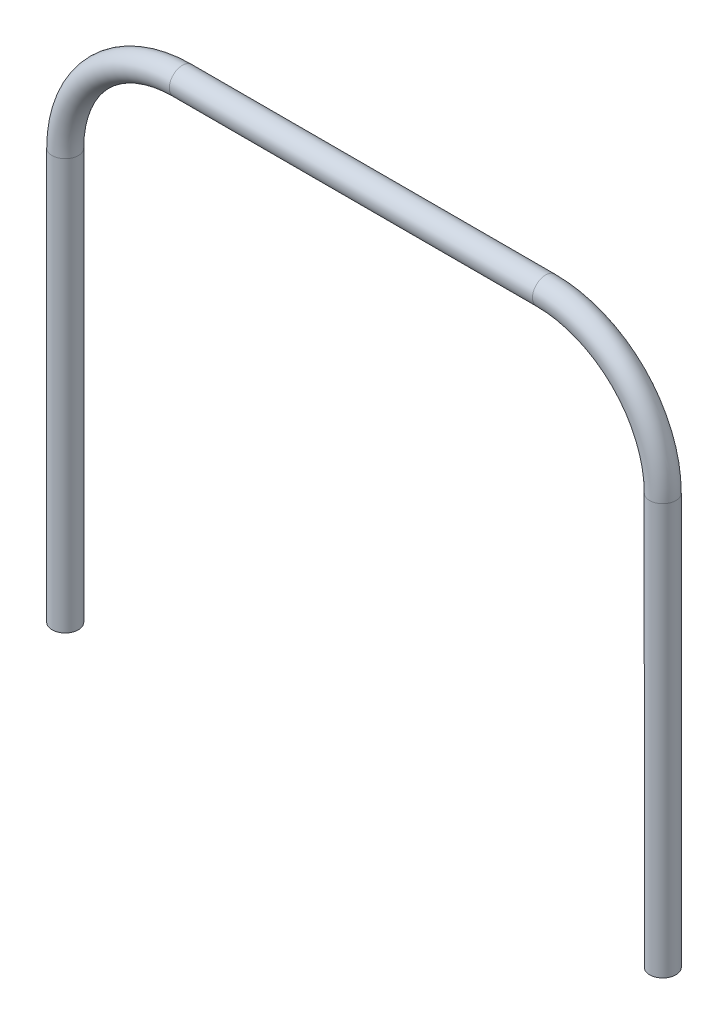
ISO-10303-21;
HEADER;
FILE_DESCRIPTION(('STEP AP214'),'2;1');
FILE_NAME('part.step','',(''),(''),'','','');
FILE_SCHEMA(('AUTOMOTIVE_DESIGN { 1 0 10303 214 1 1 1 1 }'));
ENDSEC;
DATA;
#1=APPLICATION_CONTEXT('core data for automotive mechanical design processes');
#2=APPLICATION_PROTOCOL_DEFINITION('international standard','automotive_design',2000,#1);
#3=PRODUCT_CONTEXT('',#1,'mechanical');
#4=PRODUCT('Part','Part','',(#3));
#5=PRODUCT_RELATED_PRODUCT_CATEGORY('part','',(#4));
#6=PRODUCT_DEFINITION_FORMATION('','',#4);
#7=PRODUCT_DEFINITION_CONTEXT('part definition',#1,'design');
#8=PRODUCT_DEFINITION('design','',#6,#7);
#9=PRODUCT_DEFINITION_SHAPE('','',#8);
#10=(LENGTH_UNIT() NAMED_UNIT(*) SI_UNIT(.MILLI.,.METRE.));
#11=(NAMED_UNIT(*) PLANE_ANGLE_UNIT() SI_UNIT($,.RADIAN.));
#12=(NAMED_UNIT(*) SI_UNIT($,.STERADIAN.) SOLID_ANGLE_UNIT());
#13=UNCERTAINTY_MEASURE_WITH_UNIT(LENGTH_MEASURE(1.E-05),#10,'distance_accuracy_value','');
#14=(GEOMETRIC_REPRESENTATION_CONTEXT(3) GLOBAL_UNCERTAINTY_ASSIGNED_CONTEXT((#13)) GLOBAL_UNIT_ASSIGNED_CONTEXT((#10,
#11,#12)) REPRESENTATION_CONTEXT('',''));
#15=CARTESIAN_POINT('',(0.,0.,0.));
#16=DIRECTION('',(0.,0.,1.));
#17=DIRECTION('',(1.,0.,0.));
#18=AXIS2_PLACEMENT_3D('',#15,#16,#17);
#19=CARTESIAN_POINT('',(0.,0.,0.));
#20=DIRECTION('',(0.,1.,0.));
#21=DIRECTION('',(0.,0.,1.));
#22=AXIS2_PLACEMENT_3D('',#19,#20,#21);
#23=CYLINDRICAL_SURFACE('',#22,19.);
#24=CARTESIAN_POINT('',(0.,596.,0.));
#25=DIRECTION('',(0.,1.,0.));
#26=DIRECTION('',(0.,0.,1.));
#27=AXIS2_PLACEMENT_3D('',#24,#25,#26);
#28=CIRCLE('',#27,19.);
#29=CARTESIAN_POINT('',(-19.,596.,0.));
#30=VERTEX_POINT('',#29);
#31=EDGE_CURVE('E85',#30,#30,#28,.T.);
#32=ORIENTED_EDGE('',*,*,#31,.F.);
#33=EDGE_LOOP('',(#32));
#34=FACE_BOUND('',#33,.T.);
#35=CARTESIAN_POINT('',(0.,0.,0.));
#36=DIRECTION('',(0.,1.,0.));
#37=DIRECTION('',(0.,0.,1.));
#38=AXIS2_PLACEMENT_3D('',#35,#36,#37);
#39=CIRCLE('',#38,19.);
#40=CARTESIAN_POINT('',(0.,0.,19.));
#41=VERTEX_POINT('',#40);
#42=EDGE_CURVE('E52',#41,#41,#39,.T.);
#43=ORIENTED_EDGE('',*,*,#42,.T.);
#44=EDGE_LOOP('',(#43));
#45=FACE_BOUND('',#44,.T.);
#46=ADVANCED_FACE('F37',(#34,#45),#23,.T.);
#47=CARTESIAN_POINT('',(170.,596.,0.));
#48=DIRECTION('',(0.,0.,-1.));
#49=DIRECTION('',(-1.,0.,0.));
#50=AXIS2_PLACEMENT_3D('',#47,#48,#49);
#51=TOROIDAL_SURFACE('',#50,170.,19.);
#52=CARTESIAN_POINT('',(170.,766.,0.));
#53=DIRECTION('',(1.,0.,0.));
#54=DIRECTION('',(0.,0.,1.));
#55=AXIS2_PLACEMENT_3D('',#52,#53,#54);
#56=CIRCLE('',#55,19.);
#57=CARTESIAN_POINT('',(170.,785.,0.));
#58=VERTEX_POINT('',#57);
#59=EDGE_CURVE('E88',#58,#58,#56,.T.);
#60=CARTESIAN_POINT('',(170.,596.,0.));
#61=DIRECTION('',(0.,0.,-1.));
#62=DIRECTION('',(-1.,0.,0.));
#63=AXIS2_PLACEMENT_3D('',#60,#61,#62);
#64=CIRCLE('',#63,189.);
#65=EDGE_CURVE('',#30,#58,#64,.T.);
#66=ORIENTED_EDGE('',*,*,#31,.T.);
#67=ORIENTED_EDGE('',*,*,#59,.F.);
#68=ORIENTED_EDGE('',*,*,#65,.T.);
#69=ORIENTED_EDGE('',*,*,#65,.F.);
#70=EDGE_LOOP('',(#66,#68,#67,#69));
#71=FACE_BOUND('',#70,.T.);
#72=ADVANCED_FACE('F106',(#71),#51,.T.);
#73=CARTESIAN_POINT('',(170.,766.,0.));
#74=DIRECTION('',(1.,0.,0.));
#75=DIRECTION('',(0.,0.,-1.));
#76=AXIS2_PLACEMENT_3D('',#73,#74,#75);
#77=CYLINDRICAL_SURFACE('',#76,19.);
#78=CARTESIAN_POINT('',(697.,766.,0.));
#79=DIRECTION('',(1.,0.,0.));
#80=DIRECTION('',(0.,0.,1.));
#81=AXIS2_PLACEMENT_3D('',#78,#79,#80);
#82=CIRCLE('',#81,19.);
#83=CARTESIAN_POINT('',(697.,785.,0.));
#84=VERTEX_POINT('',#83);
#85=EDGE_CURVE('E90',#84,#84,#82,.T.);
#86=ORIENTED_EDGE('',*,*,#85,.F.);
#87=EDGE_LOOP('',(#86));
#88=FACE_BOUND('',#87,.T.);
#89=ORIENTED_EDGE('',*,*,#59,.T.);
#90=EDGE_LOOP('',(#89));
#91=FACE_BOUND('',#90,.T.);
#92=ADVANCED_FACE('F100',(#88,#91),#77,.T.);
#93=CARTESIAN_POINT('',(697.,596.,0.));
#94=DIRECTION('',(0.,0.,-1.));
#95=DIRECTION('',(-1.,0.,0.));
#96=AXIS2_PLACEMENT_3D('',#93,#94,#95);
#97=TOROIDAL_SURFACE('',#96,170.,19.);
#98=CARTESIAN_POINT('',(867.,596.,0.));
#99=DIRECTION('',(0.,-1.,0.));
#100=DIRECTION('',(0.,0.,1.));
#101=AXIS2_PLACEMENT_3D('',#98,#99,#100);
#102=CIRCLE('',#101,19.);
#103=CARTESIAN_POINT('',(886.,596.,0.));
#104=VERTEX_POINT('',#103);
#105=EDGE_CURVE('E41',#104,#104,#102,.T.);
#106=CARTESIAN_POINT('',(697.,596.,0.));
#107=DIRECTION('',(0.,0.,-1.));
#108=DIRECTION('',(-1.,0.,0.));
#109=AXIS2_PLACEMENT_3D('',#106,#107,#108);
#110=CIRCLE('',#109,189.);
#111=EDGE_CURVE('',#84,#104,#110,.T.);
#112=ORIENTED_EDGE('',*,*,#85,.T.);
#113=ORIENTED_EDGE('',*,*,#105,.F.);
#114=ORIENTED_EDGE('',*,*,#111,.T.);
#115=ORIENTED_EDGE('',*,*,#111,.F.);
#116=EDGE_LOOP('',(#112,#114,#113,#115));
#117=FACE_BOUND('',#116,.T.);
#118=ADVANCED_FACE('F98',(#117),#97,.T.);
#119=CARTESIAN_POINT('',(867.,596.,0.));
#120=DIRECTION('',(0.,-1.,0.));
#121=DIRECTION('',(1.,0.,0.));
#122=AXIS2_PLACEMENT_3D('',#119,#120,#121);
#123=CYLINDRICAL_SURFACE('',#122,19.);
#124=CARTESIAN_POINT('',(867.,1.11022302462516E-13,0.));
#125=DIRECTION('',(0.,-1.,0.));
#126=DIRECTION('',(0.,0.,1.));
#127=AXIS2_PLACEMENT_3D('',#124,#125,#126);
#128=CIRCLE('',#127,19.);
#129=CARTESIAN_POINT('',(867.,1.11022302462516E-13,19.));
#130=VERTEX_POINT('',#129);
#131=EDGE_CURVE('E57',#130,#130,#128,.T.);
#132=ORIENTED_EDGE('',*,*,#131,.F.);
#133=EDGE_LOOP('',(#132));
#134=FACE_BOUND('',#133,.T.);
#135=ORIENTED_EDGE('',*,*,#105,.T.);
#136=EDGE_LOOP('',(#135));
#137=FACE_BOUND('',#136,.T.);
#138=ADVANCED_FACE('F39',(#134,#137),#123,.T.);
#139=CARTESIAN_POINT('',(0.,0.,0.));
#140=DIRECTION('',(0.,1.,0.));
#141=DIRECTION('',(0.,0.,1.));
#142=AXIS2_PLACEMENT_3D('',#139,#140,#141);
#143=PLANE('',#142);
#144=CARTESIAN_POINT('',(0.,0.,0.));
#145=DIRECTION('',(0.,1.,0.));
#146=DIRECTION('',(0.,0.,1.));
#147=AXIS2_PLACEMENT_3D('',#144,#145,#146);
#148=CIRCLE('',#147,17.8);
#149=CARTESIAN_POINT('',(0.,0.,17.8));
#150=VERTEX_POINT('',#149);
#151=EDGE_CURVE('E83',#150,#150,#148,.F.);
#152=ORIENTED_EDGE('',*,*,#151,.F.);
#153=EDGE_LOOP('',(#152));
#154=FACE_BOUND('',#153,.T.);
#155=ORIENTED_EDGE('',*,*,#42,.F.);
#156=EDGE_LOOP('',(#155));
#157=FACE_BOUND('',#156,.T.);
#158=ADVANCED_FACE('F105',(#154,#157),#143,.F.);
#159=CARTESIAN_POINT('',(867.,1.11022302462516E-13,0.));
#160=DIRECTION('',(0.,-1.,0.));
#161=DIRECTION('',(0.,0.,1.));
#162=AXIS2_PLACEMENT_3D('',#159,#160,#161);
#163=PLANE('',#162);
#164=CARTESIAN_POINT('',(867.,1.11022302462516E-13,0.));
#165=DIRECTION('',(0.,-1.,0.));
#166=DIRECTION('',(0.,0.,1.));
#167=AXIS2_PLACEMENT_3D('',#164,#165,#166);
#168=CIRCLE('',#167,17.8);
#169=CARTESIAN_POINT('',(867.,1.11022302462516E-13,17.8));
#170=VERTEX_POINT('',#169);
#171=EDGE_CURVE('E11',#170,#170,#168,.F.);
#172=ORIENTED_EDGE('',*,*,#171,.T.);
#173=EDGE_LOOP('',(#172));
#174=FACE_BOUND('',#173,.T.);
#175=ORIENTED_EDGE('',*,*,#131,.T.);
#176=EDGE_LOOP('',(#175));
#177=FACE_BOUND('',#176,.T.);
#178=ADVANCED_FACE('F64',(#174,#177),#163,.T.);
#179=CARTESIAN_POINT('',(0.,0.,0.));
#180=DIRECTION('',(0.,1.,0.));
#181=DIRECTION('',(0.,0.,1.));
#182=AXIS2_PLACEMENT_3D('',#179,#180,#181);
#183=CYLINDRICAL_SURFACE('',#182,17.8);
#184=CARTESIAN_POINT('',(0.,596.,0.));
#185=DIRECTION('',(0.,1.,0.));
#186=DIRECTION('',(0.,0.,1.));
#187=AXIS2_PLACEMENT_3D('',#184,#185,#186);
#188=CIRCLE('',#187,17.8);
#189=CARTESIAN_POINT('',(-17.8,596.,0.));
#190=VERTEX_POINT('',#189);
#191=EDGE_CURVE('E139',#190,#190,#188,.F.);
#192=ORIENTED_EDGE('',*,*,#191,.F.);
#193=EDGE_LOOP('',(#192));
#194=FACE_BOUND('',#193,.T.);
#195=ORIENTED_EDGE('',*,*,#151,.T.);
#196=EDGE_LOOP('',(#195));
#197=FACE_BOUND('',#196,.T.);
#198=ADVANCED_FACE('F120',(#194,#197),#183,.F.);
#199=CARTESIAN_POINT('',(170.,596.,0.));
#200=DIRECTION('',(0.,0.,-1.));
#201=DIRECTION('',(-1.,0.,0.));
#202=AXIS2_PLACEMENT_3D('',#199,#200,#201);
#203=TOROIDAL_SURFACE('',#202,170.,17.8);
#204=CARTESIAN_POINT('',(170.,766.,0.));
#205=DIRECTION('',(1.,0.,0.));
#206=DIRECTION('',(0.,0.,1.));
#207=AXIS2_PLACEMENT_3D('',#204,#205,#206);
#208=CIRCLE('',#207,17.8);
#209=CARTESIAN_POINT('',(170.,783.8,0.));
#210=VERTEX_POINT('',#209);
#211=EDGE_CURVE('E78',#210,#210,#208,.F.);
#212=CARTESIAN_POINT('',(170.,596.,0.));
#213=DIRECTION('',(0.,0.,-1.));
#214=DIRECTION('',(-1.,0.,0.));
#215=AXIS2_PLACEMENT_3D('',#212,#213,#214);
#216=CIRCLE('',#215,187.8);
#217=EDGE_CURVE('',#190,#210,#216,.T.);
#218=ORIENTED_EDGE('',*,*,#191,.T.);
#219=ORIENTED_EDGE('',*,*,#211,.F.);
#220=ORIENTED_EDGE('',*,*,#217,.T.);
#221=ORIENTED_EDGE('',*,*,#217,.F.);
#222=EDGE_LOOP('',(#218,#220,#219,#221));
#223=FACE_BOUND('',#222,.T.);
#224=ADVANCED_FACE('F127',(#223),#203,.F.);
#225=CARTESIAN_POINT('',(170.,766.,0.));
#226=DIRECTION('',(1.,0.,0.));
#227=DIRECTION('',(0.,0.,-1.));
#228=AXIS2_PLACEMENT_3D('',#225,#226,#227);
#229=CYLINDRICAL_SURFACE('',#228,17.8);
#230=CARTESIAN_POINT('',(697.,766.,0.));
#231=DIRECTION('',(1.,0.,0.));
#232=DIRECTION('',(0.,0.,1.));
#233=AXIS2_PLACEMENT_3D('',#230,#231,#232);
#234=CIRCLE('',#233,17.8);
#235=CARTESIAN_POINT('',(697.,783.8,0.));
#236=VERTEX_POINT('',#235);
#237=EDGE_CURVE('E75',#236,#236,#234,.F.);
#238=ORIENTED_EDGE('',*,*,#237,.F.);
#239=EDGE_LOOP('',(#238));
#240=FACE_BOUND('',#239,.T.);
#241=ORIENTED_EDGE('',*,*,#211,.T.);
#242=EDGE_LOOP('',(#241));
#243=FACE_BOUND('',#242,.T.);
#244=ADVANCED_FACE('F124',(#240,#243),#229,.F.);
#245=CARTESIAN_POINT('',(697.,596.,0.));
#246=DIRECTION('',(0.,0.,-1.));
#247=DIRECTION('',(-1.,0.,0.));
#248=AXIS2_PLACEMENT_3D('',#245,#246,#247);
#249=TOROIDAL_SURFACE('',#248,170.,17.8);
#250=CARTESIAN_POINT('',(867.,596.,0.));
#251=DIRECTION('',(0.,-1.,0.));
#252=DIRECTION('',(0.,0.,1.));
#253=AXIS2_PLACEMENT_3D('',#250,#251,#252);
#254=CIRCLE('',#253,17.8);
#255=CARTESIAN_POINT('',(884.8,596.,0.));
#256=VERTEX_POINT('',#255);
#257=EDGE_CURVE('E46',#256,#256,#254,.F.);
#258=CARTESIAN_POINT('',(697.,596.,0.));
#259=DIRECTION('',(0.,0.,-1.));
#260=DIRECTION('',(-1.,0.,0.));
#261=AXIS2_PLACEMENT_3D('',#258,#259,#260);
#262=CIRCLE('',#261,187.8);
#263=EDGE_CURVE('',#236,#256,#262,.T.);
#264=ORIENTED_EDGE('',*,*,#237,.T.);
#265=ORIENTED_EDGE('',*,*,#257,.F.);
#266=ORIENTED_EDGE('',*,*,#263,.T.);
#267=ORIENTED_EDGE('',*,*,#263,.F.);
#268=EDGE_LOOP('',(#264,#266,#265,#267));
#269=FACE_BOUND('',#268,.T.);
#270=ADVANCED_FACE('F70',(#269),#249,.F.);
#271=CARTESIAN_POINT('',(867.,596.,0.));
#272=DIRECTION('',(0.,-1.,0.));
#273=DIRECTION('',(1.,0.,0.));
#274=AXIS2_PLACEMENT_3D('',#271,#272,#273);
#275=CYLINDRICAL_SURFACE('',#274,17.8);
#276=ORIENTED_EDGE('',*,*,#171,.F.);
#277=EDGE_LOOP('',(#276));
#278=FACE_BOUND('',#277,.T.);
#279=ORIENTED_EDGE('',*,*,#257,.T.);
#280=EDGE_LOOP('',(#279));
#281=FACE_BOUND('',#280,.T.);
#282=ADVANCED_FACE('F67',(#278,#281),#275,.F.);
#283=CLOSED_SHELL('',(#46,#72,#92,#118,#138,#158,#178,#198,#224,#244,#270,#282));
#284=MANIFOLD_SOLID_BREP('B2',#283);
#285=ADVANCED_BREP_SHAPE_REPRESENTATION('',(#18,#284),#14);
#286=SHAPE_DEFINITION_REPRESENTATION(#9,#285);
ENDSEC;
END-ISO-10303-21;
